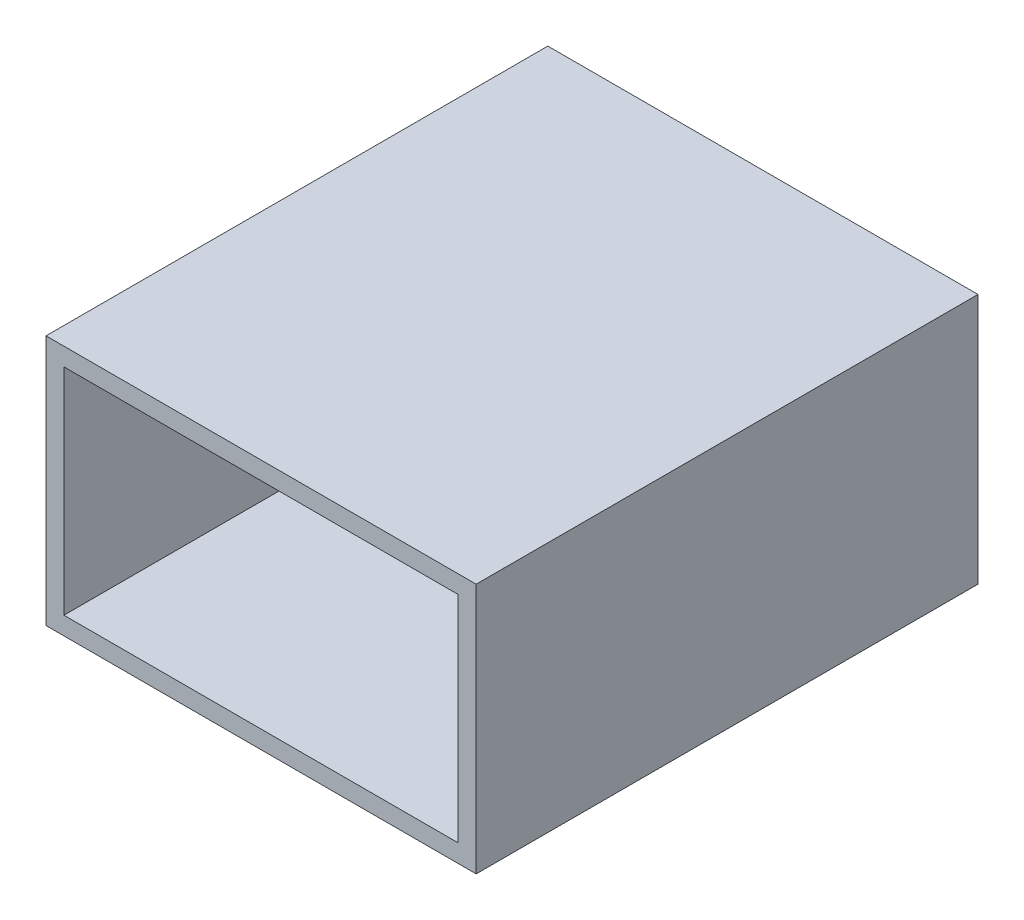
ISO-10303-21;
HEADER;
FILE_DESCRIPTION(('STEP AP214'),'2;1');
FILE_NAME('part.step','',(''),(''),'','','');
FILE_SCHEMA(('AUTOMOTIVE_DESIGN { 1 0 10303 214 1 1 1 1 }'));
ENDSEC;
DATA;
#1=APPLICATION_CONTEXT('core data for automotive mechanical design processes');
#2=APPLICATION_PROTOCOL_DEFINITION('international standard','automotive_design',2000,#1);
#3=PRODUCT_CONTEXT('',#1,'mechanical');
#4=PRODUCT('Part','Part','',(#3));
#5=PRODUCT_RELATED_PRODUCT_CATEGORY('part','',(#4));
#6=PRODUCT_DEFINITION_FORMATION('','',#4);
#7=PRODUCT_DEFINITION_CONTEXT('part definition',#1,'design');
#8=PRODUCT_DEFINITION('design','',#6,#7);
#9=PRODUCT_DEFINITION_SHAPE('','',#8);
#10=(LENGTH_UNIT() NAMED_UNIT(*) SI_UNIT(.MILLI.,.METRE.));
#11=(NAMED_UNIT(*) PLANE_ANGLE_UNIT() SI_UNIT($,.RADIAN.));
#12=(NAMED_UNIT(*) SI_UNIT($,.STERADIAN.) SOLID_ANGLE_UNIT());
#13=UNCERTAINTY_MEASURE_WITH_UNIT(LENGTH_MEASURE(1.E-05),#10,'distance_accuracy_value','');
#14=(GEOMETRIC_REPRESENTATION_CONTEXT(3) GLOBAL_UNCERTAINTY_ASSIGNED_CONTEXT((#13)) GLOBAL_UNIT_ASSIGNED_CONTEXT((#10,
#11,#12)) REPRESENTATION_CONTEXT('',''));
#15=CARTESIAN_POINT('',(0.,0.,0.));
#16=DIRECTION('',(0.,0.,1.));
#17=DIRECTION('',(1.,0.,0.));
#18=AXIS2_PLACEMENT_3D('',#15,#16,#17);
#19=CARTESIAN_POINT('',(-8.58139534883721,3.90697674418605,-27.));
#20=DIRECTION('',(-1.,0.,0.));
#21=DIRECTION('',(0.,-1.,0.));
#22=AXIS2_PLACEMENT_3D('',#19,#20,#21);
#23=PLANE('',#22);
#24=CARTESIAN_POINT('',(-8.58139534883721,-2.09302325581395,-21.));
#25=DIRECTION('',(-1.,0.,0.));
#26=DIRECTION('',(0.,-1.,0.));
#27=AXIS2_PLACEMENT_3D('',#24,#25,#26);
#28=CIRCLE('',#27,6.);
#29=CARTESIAN_POINT('',(-8.58139534883721,-8.09302325581395,-21.));
#30=VERTEX_POINT('',#29);
#31=CARTESIAN_POINT('',(-8.58139534883721,-3.8487661467028,-15.2626341496212));
#32=VERTEX_POINT('',#31);
#33=EDGE_CURVE('E65',#30,#32,#28,.T.);
#34=ORIENTED_EDGE('',*,*,#33,.T.);
#35=CARTESIAN_POINT('',(-8.58139534883721,-2.09302325581395,-13.5));
#36=DIRECTION('',(-1.,0.,0.));
#37=DIRECTION('',(0.,-1.,0.));
#38=AXIS2_PLACEMENT_3D('',#35,#36,#37);
#39=CIRCLE('',#38,2.48787303621335);
#40=CARTESIAN_POINT('',(-8.58139534883721,-0.337280364925105,-15.2626341496212));
#41=VERTEX_POINT('',#40);
#42=EDGE_CURVE('E12',#32,#41,#39,.T.);
#43=ORIENTED_EDGE('',*,*,#42,.T.);
#44=CARTESIAN_POINT('',(-8.58139534883721,3.90697674418605,-21.));
#45=VERTEX_POINT('',#44);
#46=EDGE_CURVE('E144',#41,#45,#28,.T.);
#47=ORIENTED_EDGE('',*,*,#46,.T.);
#48=DIRECTION('',(0.,0.,1.));
#49=VECTOR('',#48,1.);
#50=CARTESIAN_POINT('',(-8.58139534883721,3.90697674418605,-27.));
#51=LINE('',#50,#49);
#52=CARTESIAN_POINT('',(-8.58139534883721,3.90697674418605,0.));
#53=VERTEX_POINT('',#52);
#54=EDGE_CURVE('E158',#45,#53,#51,.T.);
#55=ORIENTED_EDGE('',*,*,#54,.T.);
#56=DIRECTION('',(0.,-1.,0.));
#57=VECTOR('',#56,1.);
#58=CARTESIAN_POINT('',(-8.58139534883721,3.90697674418605,0.));
#59=LINE('',#58,#57);
#60=CARTESIAN_POINT('',(-8.58139534883721,-8.09302325581395,0.));
#61=VERTEX_POINT('',#60);
#62=EDGE_CURVE('E149',#53,#61,#59,.T.);
#63=ORIENTED_EDGE('',*,*,#62,.T.);
#64=DIRECTION('',(0.,0.,1.));
#65=VECTOR('',#64,1.);
#66=CARTESIAN_POINT('',(-8.58139534883721,-8.09302325581395,-27.));
#67=LINE('',#66,#65);
#68=EDGE_CURVE('E173',#30,#61,#67,.T.);
#69=ORIENTED_EDGE('',*,*,#68,.F.);
#70=EDGE_LOOP('',(#34,#43,#47,#55,#63,#69));
#71=FACE_BOUND('',#70,.T.);
#72=ADVANCED_FACE('F42',(#71),#23,.F.);
#73=CARTESIAN_POINT('',(-8.58139534883721,3.90697674418605,-27.));
#74=VERTEX_POINT('',#73);
#75=EDGE_CURVE('E170',#74,#45,#51,.T.);
#76=ORIENTED_EDGE('',*,*,#75,.T.);
#77=CARTESIAN_POINT('',(-8.58139534883721,-2.09302325581395,-27.));
#78=VERTEX_POINT('',#77);
#79=EDGE_CURVE('E265',#45,#78,#28,.T.);
#80=ORIENTED_EDGE('',*,*,#79,.T.);
#81=DIRECTION('',(0.,-1.,0.));
#82=VECTOR('',#81,1.);
#83=CARTESIAN_POINT('',(-8.58139534883721,3.90697674418605,-27.));
#84=LINE('',#83,#82);
#85=EDGE_CURVE('E155',#74,#78,#84,.T.);
#86=ORIENTED_EDGE('',*,*,#85,.F.);
#87=EDGE_LOOP('',(#76,#80,#86));
#88=FACE_BOUND('',#87,.T.);
#89=ADVANCED_FACE('F237',(#88),#23,.F.);
#90=CARTESIAN_POINT('',(0.,0.,0.));
#91=DIRECTION('',(0.,0.,-1.));
#92=DIRECTION('',(-1.,0.,0.));
#93=AXIS2_PLACEMENT_3D('',#90,#91,#92);
#94=PLANE('',#93);
#95=DIRECTION('',(1.,0.,0.));
#96=VECTOR('',#95,1.);
#97=CARTESIAN_POINT('',(-9.58139534883721,-9.09302325581395,0.));
#98=LINE('',#97,#96);
#99=CARTESIAN_POINT('',(-9.58139534883721,-9.09302325581395,0.));
#100=VERTEX_POINT('',#99);
#101=CARTESIAN_POINT('',(14.4186046511628,-9.09302325581395,0.));
#102=VERTEX_POINT('',#101);
#103=EDGE_CURVE('E182',#100,#102,#98,.T.);
#104=ORIENTED_EDGE('',*,*,#103,.T.);
#105=DIRECTION('',(0.,-1.,0.));
#106=VECTOR('',#105,1.);
#107=CARTESIAN_POINT('',(14.4186046511628,4.90697674418605,0.));
#108=LINE('',#107,#106);
#109=CARTESIAN_POINT('',(14.4186046511628,4.90697674418605,0.));
#110=VERTEX_POINT('',#109);
#111=EDGE_CURVE('E197',#110,#102,#108,.T.);
#112=ORIENTED_EDGE('',*,*,#111,.F.);
#113=DIRECTION('',(1.,0.,0.));
#114=VECTOR('',#113,1.);
#115=CARTESIAN_POINT('',(-9.58139534883721,4.90697674418605,0.));
#116=LINE('',#115,#114);
#117=CARTESIAN_POINT('',(-9.58139534883721,4.90697674418605,0.));
#118=VERTEX_POINT('',#117);
#119=EDGE_CURVE('E200',#118,#110,#116,.T.);
#120=ORIENTED_EDGE('',*,*,#119,.F.);
#121=DIRECTION('',(0.,-1.,0.));
#122=VECTOR('',#121,1.);
#123=CARTESIAN_POINT('',(-9.58139534883721,4.90697674418605,0.));
#124=LINE('',#123,#122);
#125=EDGE_CURVE('E187',#118,#100,#124,.T.);
#126=ORIENTED_EDGE('',*,*,#125,.T.);
#127=EDGE_LOOP('',(#104,#112,#120,#126));
#128=FACE_BOUND('',#127,.T.);
#129=DIRECTION('',(1.,0.,0.));
#130=VECTOR('',#129,1.);
#131=CARTESIAN_POINT('',(-8.58139534883721,3.90697674418605,0.));
#132=LINE('',#131,#130);
#133=CARTESIAN_POINT('',(13.4186046511628,3.90697674418605,0.));
#134=VERTEX_POINT('',#133);
#135=EDGE_CURVE('E159',#53,#134,#132,.T.);
#136=ORIENTED_EDGE('',*,*,#135,.T.);
#137=DIRECTION('',(0.,-1.,0.));
#138=VECTOR('',#137,1.);
#139=CARTESIAN_POINT('',(13.4186046511628,3.90697674418605,0.));
#140=LINE('',#139,#138);
#141=CARTESIAN_POINT('',(13.4186046511628,-8.09302325581395,0.));
#142=VERTEX_POINT('',#141);
#143=EDGE_CURVE('E162',#134,#142,#140,.T.);
#144=ORIENTED_EDGE('',*,*,#143,.T.);
#145=DIRECTION('',(1.,0.,0.));
#146=VECTOR('',#145,1.);
#147=CARTESIAN_POINT('',(-8.58139534883721,-8.09302325581395,0.));
#148=LINE('',#147,#146);
#149=EDGE_CURVE('E165',#61,#142,#148,.T.);
#150=ORIENTED_EDGE('',*,*,#149,.F.);
#151=ORIENTED_EDGE('',*,*,#62,.F.);
#152=EDGE_LOOP('',(#136,#144,#150,#151));
#153=FACE_BOUND('',#152,.T.);
#154=ADVANCED_FACE('F220',(#128,#153),#94,.F.);
#155=CARTESIAN_POINT('',(-9.58139534883721,-9.09302325581395,-28.));
#156=DIRECTION('',(0.,-1.,0.));
#157=DIRECTION('',(0.,0.,-1.));
#158=AXIS2_PLACEMENT_3D('',#155,#156,#157);
#159=PLANE('',#158);
#160=ORIENTED_EDGE('',*,*,#103,.F.);
#161=DIRECTION('',(0.,0.,1.));
#162=VECTOR('',#161,1.);
#163=CARTESIAN_POINT('',(-9.58139534883721,-9.09302325581395,-28.));
#164=LINE('',#163,#162);
#165=CARTESIAN_POINT('',(-9.58139534883721,-9.09302325581395,-28.));
#166=VERTEX_POINT('',#165);
#167=EDGE_CURVE('E50',#166,#100,#164,.T.);
#168=ORIENTED_EDGE('',*,*,#167,.F.);
#169=DIRECTION('',(1.,0.,0.));
#170=VECTOR('',#169,1.);
#171=CARTESIAN_POINT('',(-9.58139534883721,-9.09302325581395,-28.));
#172=LINE('',#171,#170);
#173=CARTESIAN_POINT('',(14.4186046511628,-9.09302325581395,-28.));
#174=VERTEX_POINT('',#173);
#175=EDGE_CURVE('E183',#166,#174,#172,.T.);
#176=ORIENTED_EDGE('',*,*,#175,.T.);
#177=DIRECTION('',(0.,0.,1.));
#178=VECTOR('',#177,1.);
#179=CARTESIAN_POINT('',(14.4186046511628,-9.09302325581395,-28.));
#180=LINE('',#179,#178);
#181=EDGE_CURVE('E194',#174,#102,#180,.T.);
#182=ORIENTED_EDGE('',*,*,#181,.T.);
#183=EDGE_LOOP('',(#160,#168,#176,#182));
#184=FACE_BOUND('',#183,.T.);
#185=ADVANCED_FACE('F44',(#184),#159,.T.);
#186=CARTESIAN_POINT('',(-9.58139534883721,4.90697674418605,-28.));
#187=DIRECTION('',(-1.,0.,0.));
#188=DIRECTION('',(0.,0.,1.));
#189=AXIS2_PLACEMENT_3D('',#186,#187,#188);
#190=PLANE('',#189);
#191=CARTESIAN_POINT('',(-9.58139534883721,-2.09302325581395,-13.5));
#192=DIRECTION('',(-1.,0.,0.));
#193=DIRECTION('',(0.,0.,1.));
#194=AXIS2_PLACEMENT_3D('',#191,#192,#193);
#195=CIRCLE('',#194,2.48787303621335);
#196=CARTESIAN_POINT('',(-9.58139534883721,-3.8487661467028,-15.2626341496212));
#197=VERTEX_POINT('',#196);
#198=CARTESIAN_POINT('',(-9.58139534883721,-0.337280364925105,-15.2626341496212));
#199=VERTEX_POINT('',#198);
#200=EDGE_CURVE('E57',#197,#199,#195,.T.);
#201=ORIENTED_EDGE('',*,*,#200,.F.);
#202=CARTESIAN_POINT('',(-9.58139534883721,-2.09302325581395,-21.));
#203=DIRECTION('',(-1.,0.,0.));
#204=DIRECTION('',(0.,0.,1.));
#205=AXIS2_PLACEMENT_3D('',#202,#203,#204);
#206=CIRCLE('',#205,6.);
#207=EDGE_CURVE('E134',#199,#197,#206,.T.);
#208=ORIENTED_EDGE('',*,*,#207,.F.);
#209=EDGE_LOOP('',(#201,#208));
#210=FACE_BOUND('',#209,.T.);
#211=ORIENTED_EDGE('',*,*,#125,.F.);
#212=DIRECTION('',(0.,0.,1.));
#213=VECTOR('',#212,1.);
#214=CARTESIAN_POINT('',(-9.58139534883721,4.90697674418605,-28.));
#215=LINE('',#214,#213);
#216=CARTESIAN_POINT('',(-9.58139534883721,4.90697674418605,-28.));
#217=VERTEX_POINT('',#216);
#218=EDGE_CURVE('E205',#217,#118,#215,.T.);
#219=ORIENTED_EDGE('',*,*,#218,.F.);
#220=DIRECTION('',(0.,-1.,0.));
#221=VECTOR('',#220,1.);
#222=CARTESIAN_POINT('',(-9.58139534883721,4.90697674418605,-28.));
#223=LINE('',#222,#221);
#224=EDGE_CURVE('E191',#217,#166,#223,.T.);
#225=ORIENTED_EDGE('',*,*,#224,.T.);
#226=ORIENTED_EDGE('',*,*,#167,.T.);
#227=EDGE_LOOP('',(#211,#219,#225,#226));
#228=FACE_BOUND('',#227,.T.);
#229=ADVANCED_FACE('F138',(#210,#228),#190,.T.);
#230=CARTESIAN_POINT('',(-9.58139534883721,4.90697674418605,-28.));
#231=DIRECTION('',(0.,-1.,0.));
#232=DIRECTION('',(1.,0.,0.));
#233=AXIS2_PLACEMENT_3D('',#230,#231,#232);
#234=PLANE('',#233);
#235=ORIENTED_EDGE('',*,*,#119,.T.);
#236=DIRECTION('',(0.,0.,1.));
#237=VECTOR('',#236,1.);
#238=CARTESIAN_POINT('',(14.4186046511628,4.90697674418605,-28.));
#239=LINE('',#238,#237);
#240=CARTESIAN_POINT('',(14.4186046511628,4.90697674418605,-28.));
#241=VERTEX_POINT('',#240);
#242=EDGE_CURVE('E207',#241,#110,#239,.T.);
#243=ORIENTED_EDGE('',*,*,#242,.F.);
#244=DIRECTION('',(1.,0.,0.));
#245=VECTOR('',#244,1.);
#246=CARTESIAN_POINT('',(-9.58139534883721,4.90697674418605,-28.));
#247=LINE('',#246,#245);
#248=EDGE_CURVE('E189',#217,#241,#247,.T.);
#249=ORIENTED_EDGE('',*,*,#248,.F.);
#250=ORIENTED_EDGE('',*,*,#218,.T.);
#251=EDGE_LOOP('',(#235,#243,#249,#250));
#252=FACE_BOUND('',#251,.T.);
#253=ADVANCED_FACE('F228',(#252),#234,.F.);
#254=CARTESIAN_POINT('',(14.4186046511628,4.90697674418605,-28.));
#255=DIRECTION('',(-1.,0.,0.));
#256=DIRECTION('',(0.,0.,1.));
#257=AXIS2_PLACEMENT_3D('',#254,#255,#256);
#258=PLANE('',#257);
#259=ORIENTED_EDGE('',*,*,#111,.T.);
#260=ORIENTED_EDGE('',*,*,#181,.F.);
#261=DIRECTION('',(0.,-1.,0.));
#262=VECTOR('',#261,1.);
#263=CARTESIAN_POINT('',(14.4186046511628,4.90697674418605,-28.));
#264=LINE('',#263,#262);
#265=EDGE_CURVE('E186',#241,#174,#264,.T.);
#266=ORIENTED_EDGE('',*,*,#265,.F.);
#267=ORIENTED_EDGE('',*,*,#242,.T.);
#268=EDGE_LOOP('',(#259,#260,#266,#267));
#269=FACE_BOUND('',#268,.T.);
#270=ADVANCED_FACE('F216',(#269),#258,.F.);
#271=CARTESIAN_POINT('',(0.,0.,-28.));
#272=DIRECTION('',(0.,0.,-1.));
#273=DIRECTION('',(-1.,0.,0.));
#274=AXIS2_PLACEMENT_3D('',#271,#272,#273);
#275=PLANE('',#274);
#276=ORIENTED_EDGE('',*,*,#175,.F.);
#277=ORIENTED_EDGE('',*,*,#224,.F.);
#278=ORIENTED_EDGE('',*,*,#248,.T.);
#279=ORIENTED_EDGE('',*,*,#265,.T.);
#280=EDGE_LOOP('',(#276,#277,#278,#279));
#281=FACE_BOUND('',#280,.T.);
#282=ADVANCED_FACE('F226',(#281),#275,.T.);
#283=CARTESIAN_POINT('',(-8.58139534883721,3.90697674418605,-27.));
#284=DIRECTION('',(0.,-1.,0.));
#285=DIRECTION('',(0.,0.,-1.));
#286=AXIS2_PLACEMENT_3D('',#283,#284,#285);
#287=PLANE('',#286);
#288=ORIENTED_EDGE('',*,*,#54,.F.);
#289=ORIENTED_EDGE('',*,*,#75,.F.);
#290=DIRECTION('',(1.,0.,0.));
#291=VECTOR('',#290,1.);
#292=CARTESIAN_POINT('',(-8.58139534883721,3.90697674418605,-27.));
#293=LINE('',#292,#291);
#294=CARTESIAN_POINT('',(13.4186046511628,3.90697674418605,-27.));
#295=VERTEX_POINT('',#294);
#296=EDGE_CURVE('E145',#74,#295,#293,.T.);
#297=ORIENTED_EDGE('',*,*,#296,.T.);
#298=DIRECTION('',(0.,0.,1.));
#299=VECTOR('',#298,1.);
#300=CARTESIAN_POINT('',(13.4186046511628,3.90697674418605,-27.));
#301=LINE('',#300,#299);
#302=EDGE_CURVE('E179',#295,#134,#301,.T.);
#303=ORIENTED_EDGE('',*,*,#302,.T.);
#304=ORIENTED_EDGE('',*,*,#135,.F.);
#305=EDGE_LOOP('',(#288,#289,#297,#303,#304));
#306=FACE_BOUND('',#305,.T.);
#307=ADVANCED_FACE('F274',(#306),#287,.T.);
#308=CARTESIAN_POINT('',(13.4186046511628,3.90697674418605,-27.));
#309=DIRECTION('',(-1.,0.,0.));
#310=DIRECTION('',(0.,0.,1.));
#311=AXIS2_PLACEMENT_3D('',#308,#309,#310);
#312=PLANE('',#311);
#313=ORIENTED_EDGE('',*,*,#143,.F.);
#314=ORIENTED_EDGE('',*,*,#302,.F.);
#315=DIRECTION('',(0.,-1.,0.));
#316=VECTOR('',#315,1.);
#317=CARTESIAN_POINT('',(13.4186046511628,3.90697674418605,-27.));
#318=LINE('',#317,#316);
#319=CARTESIAN_POINT('',(13.4186046511628,-8.09302325581395,-27.));
#320=VERTEX_POINT('',#319);
#321=EDGE_CURVE('E148',#295,#320,#318,.T.);
#322=ORIENTED_EDGE('',*,*,#321,.T.);
#323=DIRECTION('',(0.,0.,1.));
#324=VECTOR('',#323,1.);
#325=CARTESIAN_POINT('',(13.4186046511628,-8.09302325581395,-27.));
#326=LINE('',#325,#324);
#327=EDGE_CURVE('E177',#320,#142,#326,.T.);
#328=ORIENTED_EDGE('',*,*,#327,.T.);
#329=EDGE_LOOP('',(#313,#314,#322,#328));
#330=FACE_BOUND('',#329,.T.);
#331=ADVANCED_FACE('F256',(#330),#312,.T.);
#332=CARTESIAN_POINT('',(-8.58139534883721,-8.09302325581395,-27.));
#333=DIRECTION('',(0.,-1.,0.));
#334=DIRECTION('',(1.,0.,0.));
#335=AXIS2_PLACEMENT_3D('',#332,#333,#334);
#336=PLANE('',#335);
#337=CARTESIAN_POINT('',(-8.58139534883721,-8.09302325581395,-27.));
#338=VERTEX_POINT('',#337);
#339=EDGE_CURVE('E174',#338,#30,#67,.T.);
#340=ORIENTED_EDGE('',*,*,#339,.T.);
#341=ORIENTED_EDGE('',*,*,#68,.T.);
#342=ORIENTED_EDGE('',*,*,#149,.T.);
#343=ORIENTED_EDGE('',*,*,#327,.F.);
#344=DIRECTION('',(1.,0.,0.));
#345=VECTOR('',#344,1.);
#346=CARTESIAN_POINT('',(-8.58139534883721,-8.09302325581395,-27.));
#347=LINE('',#346,#345);
#348=EDGE_CURVE('E151',#338,#320,#347,.T.);
#349=ORIENTED_EDGE('',*,*,#348,.F.);
#350=EDGE_LOOP('',(#340,#341,#342,#343,#349));
#351=FACE_BOUND('',#350,.T.);
#352=ADVANCED_FACE('F249',(#351),#336,.F.);
#353=EDGE_CURVE('E154',#78,#338,#84,.T.);
#354=ORIENTED_EDGE('',*,*,#353,.F.);
#355=EDGE_CURVE('E130',#78,#30,#28,.T.);
#356=ORIENTED_EDGE('',*,*,#355,.T.);
#357=ORIENTED_EDGE('',*,*,#339,.F.);
#358=EDGE_LOOP('',(#354,#356,#357));
#359=FACE_BOUND('',#358,.T.);
#360=ADVANCED_FACE('F240',(#359),#23,.F.);
#361=CARTESIAN_POINT('',(0.,0.,-27.));
#362=DIRECTION('',(0.,0.,-1.));
#363=DIRECTION('',(-1.,0.,0.));
#364=AXIS2_PLACEMENT_3D('',#361,#362,#363);
#365=PLANE('',#364);
#366=ORIENTED_EDGE('',*,*,#85,.T.);
#367=ORIENTED_EDGE('',*,*,#353,.T.);
#368=ORIENTED_EDGE('',*,*,#348,.T.);
#369=ORIENTED_EDGE('',*,*,#321,.F.);
#370=ORIENTED_EDGE('',*,*,#296,.F.);
#371=EDGE_LOOP('',(#366,#367,#368,#369,#370));
#372=FACE_BOUND('',#371,.T.);
#373=ADVANCED_FACE('F248',(#372),#365,.F.);
#374=CARTESIAN_POINT('',(-4.58139534883721,-2.09302325581395,-13.5));
#375=DIRECTION('',(-1.,0.,0.));
#376=DIRECTION('',(0.,0.,1.));
#377=AXIS2_PLACEMENT_3D('',#374,#375,#376);
#378=CYLINDRICAL_SURFACE('',#377,2.48787303621335);
#379=DIRECTION('',(-1.,0.,0.));
#380=VECTOR('',#379,1.);
#381=CARTESIAN_POINT('',(-4.58139534883721,-3.8487661467028,-15.2626341496212));
#382=LINE('',#381,#380);
#383=EDGE_CURVE('E127',#32,#197,#382,.T.);
#384=ORIENTED_EDGE('',*,*,#383,.T.);
#385=ORIENTED_EDGE('',*,*,#200,.T.);
#386=DIRECTION('',(-1.,0.,0.));
#387=VECTOR('',#386,1.);
#388=CARTESIAN_POINT('',(-4.58139534883721,-0.337280364925105,-15.2626341496212));
#389=LINE('',#388,#387);
#390=EDGE_CURVE('E131',#41,#199,#389,.T.);
#391=ORIENTED_EDGE('',*,*,#390,.F.);
#392=ORIENTED_EDGE('',*,*,#42,.F.);
#393=EDGE_LOOP('',(#384,#385,#391,#392));
#394=FACE_BOUND('',#393,.T.);
#395=ADVANCED_FACE('F129',(#394),#378,.F.);
#396=CARTESIAN_POINT('',(-4.58139534883721,-2.09302325581395,-21.));
#397=DIRECTION('',(-1.,0.,0.));
#398=DIRECTION('',(0.,0.,1.));
#399=AXIS2_PLACEMENT_3D('',#396,#397,#398);
#400=CYLINDRICAL_SURFACE('',#399,6.);
#401=ORIENTED_EDGE('',*,*,#390,.T.);
#402=ORIENTED_EDGE('',*,*,#207,.T.);
#403=ORIENTED_EDGE('',*,*,#383,.F.);
#404=ORIENTED_EDGE('',*,*,#33,.F.);
#405=ORIENTED_EDGE('',*,*,#355,.F.);
#406=ORIENTED_EDGE('',*,*,#79,.F.);
#407=ORIENTED_EDGE('',*,*,#46,.F.);
#408=EDGE_LOOP('',(#401,#402,#403,#404,#405,#406,#407));
#409=FACE_BOUND('',#408,.T.);
#410=ADVANCED_FACE('F135',(#409),#400,.F.);
#411=CLOSED_SHELL('',(#72,#89,#154,#185,#229,#253,#270,#282,#307,#331,#352,#360,#373,#395,#410));
#412=MANIFOLD_SOLID_BREP('B2',#411);
#413=ADVANCED_BREP_SHAPE_REPRESENTATION('',(#18,#412),#14);
#414=SHAPE_DEFINITION_REPRESENTATION(#9,#413);
ENDSEC;
END-ISO-10303-21;
